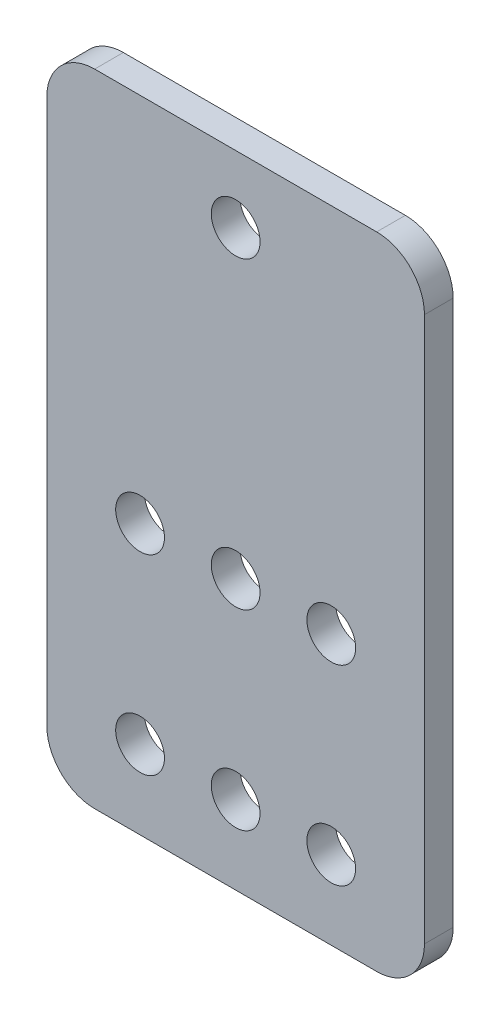
ISO-10303-21;
HEADER;
FILE_DESCRIPTION(('STEP AP214'),'2;1');
FILE_NAME('part.step','',(''),(''),'','','');
FILE_SCHEMA(('AUTOMOTIVE_DESIGN { 1 0 10303 214 1 1 1 1 }'));
ENDSEC;
DATA;
#1=APPLICATION_CONTEXT('core data for automotive mechanical design processes');
#2=APPLICATION_PROTOCOL_DEFINITION('international standard','automotive_design',2000,#1);
#3=PRODUCT_CONTEXT('',#1,'mechanical');
#4=PRODUCT('Part','Part','',(#3));
#5=PRODUCT_RELATED_PRODUCT_CATEGORY('part','',(#4));
#6=PRODUCT_DEFINITION_FORMATION('','',#4);
#7=PRODUCT_DEFINITION_CONTEXT('part definition',#1,'design');
#8=PRODUCT_DEFINITION('design','',#6,#7);
#9=PRODUCT_DEFINITION_SHAPE('','',#8);
#10=(LENGTH_UNIT() NAMED_UNIT(*) SI_UNIT(.MILLI.,.METRE.));
#11=(NAMED_UNIT(*) PLANE_ANGLE_UNIT() SI_UNIT($,.RADIAN.));
#12=(NAMED_UNIT(*) SI_UNIT($,.STERADIAN.) SOLID_ANGLE_UNIT());
#13=UNCERTAINTY_MEASURE_WITH_UNIT(LENGTH_MEASURE(1.E-05),#10,'distance_accuracy_value','');
#14=(GEOMETRIC_REPRESENTATION_CONTEXT(3) GLOBAL_UNCERTAINTY_ASSIGNED_CONTEXT((#13)) GLOBAL_UNIT_ASSIGNED_CONTEXT((#10,
#11,#12)) REPRESENTATION_CONTEXT('',''));
#15=CARTESIAN_POINT('',(0.,0.,0.));
#16=DIRECTION('',(0.,0.,1.));
#17=DIRECTION('',(1.,0.,0.));
#18=AXIS2_PLACEMENT_3D('',#15,#16,#17);
#19=CARTESIAN_POINT('',(-14.75,-28.5,3.));
#20=DIRECTION('',(0.,0.,-1.));
#21=DIRECTION('',(-1.,0.,0.));
#22=AXIS2_PLACEMENT_3D('',#19,#20,#21);
#23=PLANE('',#22);
#24=CARTESIAN_POINT('',(-14.75,-28.5,3.));
#25=DIRECTION('',(0.,0.,1.));
#26=DIRECTION('',(-1.,0.,0.));
#27=AXIS2_PLACEMENT_3D('',#24,#25,#26);
#28=CIRCLE('',#27,5.);
#29=CARTESIAN_POINT('',(-19.75,-28.5,3.));
#30=VERTEX_POINT('',#29);
#31=CARTESIAN_POINT('',(-14.75,-33.5,3.));
#32=VERTEX_POINT('',#31);
#33=EDGE_CURVE('E158',#30,#32,#28,.T.);
#34=ORIENTED_EDGE('',*,*,#33,.T.);
#35=DIRECTION('',(1.,0.,0.));
#36=VECTOR('',#35,1.);
#37=CARTESIAN_POINT('',(-14.75,-33.5,3.));
#38=LINE('',#37,#36);
#39=CARTESIAN_POINT('',(14.75,-33.5,3.));
#40=VERTEX_POINT('',#39);
#41=EDGE_CURVE('E105',#32,#40,#38,.T.);
#42=ORIENTED_EDGE('',*,*,#41,.T.);
#43=CARTESIAN_POINT('',(14.75,-28.5,3.));
#44=DIRECTION('',(0.,0.,1.));
#45=DIRECTION('',(1.,0.,0.));
#46=AXIS2_PLACEMENT_3D('',#43,#44,#45);
#47=CIRCLE('',#46,5.);
#48=CARTESIAN_POINT('',(19.75,-28.5,3.));
#49=VERTEX_POINT('',#48);
#50=EDGE_CURVE('E173',#40,#49,#47,.T.);
#51=ORIENTED_EDGE('',*,*,#50,.T.);
#52=DIRECTION('',(0.,1.,0.));
#53=VECTOR('',#52,1.);
#54=CARTESIAN_POINT('',(19.75,-28.5,3.));
#55=LINE('',#54,#53);
#56=CARTESIAN_POINT('',(19.75,28.5,3.));
#57=VERTEX_POINT('',#56);
#58=EDGE_CURVE('E186',#49,#57,#55,.T.);
#59=ORIENTED_EDGE('',*,*,#58,.T.);
#60=CARTESIAN_POINT('',(14.75,28.5,3.));
#61=DIRECTION('',(0.,0.,1.));
#62=DIRECTION('',(-1.,0.,0.));
#63=AXIS2_PLACEMENT_3D('',#60,#61,#62);
#64=CIRCLE('',#63,5.);
#65=CARTESIAN_POINT('',(14.75,33.5,3.));
#66=VERTEX_POINT('',#65);
#67=EDGE_CURVE('E124',#57,#66,#64,.T.);
#68=ORIENTED_EDGE('',*,*,#67,.T.);
#69=DIRECTION('',(-1.,0.,0.));
#70=VECTOR('',#69,1.);
#71=CARTESIAN_POINT('',(-14.75,33.5,3.));
#72=LINE('',#71,#70);
#73=CARTESIAN_POINT('',(-14.75,33.5,3.));
#74=VERTEX_POINT('',#73);
#75=EDGE_CURVE('E118',#66,#74,#72,.T.);
#76=ORIENTED_EDGE('',*,*,#75,.T.);
#77=CARTESIAN_POINT('',(-14.75,28.5,3.));
#78=DIRECTION('',(0.,0.,1.));
#79=DIRECTION('',(-1.,0.,0.));
#80=AXIS2_PLACEMENT_3D('',#77,#78,#79);
#81=CIRCLE('',#80,5.);
#82=CARTESIAN_POINT('',(-19.75,28.5,3.));
#83=VERTEX_POINT('',#82);
#84=EDGE_CURVE('E122',#74,#83,#81,.T.);
#85=ORIENTED_EDGE('',*,*,#84,.T.);
#86=DIRECTION('',(0.,-1.,0.));
#87=VECTOR('',#86,1.);
#88=CARTESIAN_POINT('',(-19.75,-28.5,3.));
#89=LINE('',#88,#87);
#90=EDGE_CURVE('E62',#83,#30,#89,.T.);
#91=ORIENTED_EDGE('',*,*,#90,.T.);
#92=EDGE_LOOP('',(#34,#42,#51,#59,#68,#76,#85,#91));
#93=FACE_BOUND('',#92,.T.);
#94=CARTESIAN_POINT('',(9.99999324787507,-5.28999999999959,3.));
#95=DIRECTION('',(0.,0.,1.));
#96=DIRECTION('',(1.,0.,0.));
#97=AXIS2_PLACEMENT_3D('',#94,#95,#96);
#98=CIRCLE('',#97,2.55);
#99=CARTESIAN_POINT('',(12.5499932478751,-5.28999999999959,3.));
#100=VERTEX_POINT('',#99);
#101=EDGE_CURVE('E146',#100,#100,#98,.T.);
#102=ORIENTED_EDGE('',*,*,#101,.F.);
#103=EDGE_LOOP('',(#102));
#104=FACE_BOUND('',#103,.T.);
#105=CARTESIAN_POINT('',(0.,-5.28999999999959,3.));
#106=DIRECTION('',(0.,0.,1.));
#107=DIRECTION('',(1.,0.,0.));
#108=AXIS2_PLACEMENT_3D('',#105,#106,#107);
#109=CIRCLE('',#108,2.54999999999988);
#110=CARTESIAN_POINT('',(2.54999999999988,-5.28999999999959,3.));
#111=VERTEX_POINT('',#110);
#112=EDGE_CURVE('E197',#111,#111,#109,.T.);
#113=ORIENTED_EDGE('',*,*,#112,.F.);
#114=EDGE_LOOP('',(#113));
#115=FACE_BOUND('',#114,.T.);
#116=CARTESIAN_POINT('',(-9.99999324787506,-5.28999999999959,3.));
#117=DIRECTION('',(0.,0.,1.));
#118=DIRECTION('',(1.,0.,0.));
#119=AXIS2_PLACEMENT_3D('',#116,#117,#118);
#120=CIRCLE('',#119,2.55);
#121=CARTESIAN_POINT('',(-7.44999324787506,-5.28999999999959,3.));
#122=VERTEX_POINT('',#121);
#123=EDGE_CURVE('E204',#122,#122,#120,.T.);
#124=ORIENTED_EDGE('',*,*,#123,.F.);
#125=EDGE_LOOP('',(#124));
#126=FACE_BOUND('',#125,.T.);
#127=CARTESIAN_POINT('',(6.7705587926267E-06,-25.2899999999987,3.));
#128=DIRECTION('',(0.,0.,1.));
#129=DIRECTION('',(1.,0.,0.));
#130=AXIS2_PLACEMENT_3D('',#127,#128,#129);
#131=CIRCLE('',#130,2.55);
#132=CARTESIAN_POINT('',(2.55000677055879,-25.2899999999987,3.));
#133=VERTEX_POINT('',#132);
#134=EDGE_CURVE('E211',#133,#133,#131,.T.);
#135=ORIENTED_EDGE('',*,*,#134,.F.);
#136=EDGE_LOOP('',(#135));
#137=FACE_BOUND('',#136,.T.);
#138=CARTESIAN_POINT('',(-9.99998647731627,-25.2899999999988,3.));
#139=DIRECTION('',(0.,0.,1.));
#140=DIRECTION('',(1.,0.,0.));
#141=AXIS2_PLACEMENT_3D('',#138,#139,#140);
#142=CIRCLE('',#141,2.55);
#143=CARTESIAN_POINT('',(-7.44998647731627,-25.2899999999988,3.));
#144=VERTEX_POINT('',#143);
#145=EDGE_CURVE('E218',#144,#144,#142,.T.);
#146=ORIENTED_EDGE('',*,*,#145,.F.);
#147=EDGE_LOOP('',(#146));
#148=FACE_BOUND('',#147,.T.);
#149=CARTESIAN_POINT('',(10.0000000184339,-25.2899999999986,3.));
#150=DIRECTION('',(0.,0.,1.));
#151=DIRECTION('',(1.,0.,0.));
#152=AXIS2_PLACEMENT_3D('',#149,#150,#151);
#153=CIRCLE('',#152,2.55);
#154=CARTESIAN_POINT('',(12.5500000184339,-25.2899999999986,3.));
#155=VERTEX_POINT('',#154);
#156=EDGE_CURVE('E224',#155,#155,#153,.T.);
#157=ORIENTED_EDGE('',*,*,#156,.F.);
#158=EDGE_LOOP('',(#157));
#159=FACE_BOUND('',#158,.T.);
#160=CARTESIAN_POINT('',(0.,26.5000000000011,3.));
#161=DIRECTION('',(0.,0.,1.));
#162=DIRECTION('',(1.,0.,0.));
#163=AXIS2_PLACEMENT_3D('',#160,#161,#162);
#164=CIRCLE('',#163,2.54999999999968);
#165=CARTESIAN_POINT('',(2.54999999999968,26.5000000000011,3.));
#166=VERTEX_POINT('',#165);
#167=EDGE_CURVE('E230',#166,#166,#164,.T.);
#168=ORIENTED_EDGE('',*,*,#167,.F.);
#169=EDGE_LOOP('',(#168));
#170=FACE_BOUND('',#169,.T.);
#171=ADVANCED_FACE('F45',(#93,#104,#115,#126,#137,#148,#159,#170),#23,.F.);
#172=CARTESIAN_POINT('',(-14.75,-28.5,0.));
#173=DIRECTION('',(0.,0.,-1.));
#174=DIRECTION('',(-1.,0.,0.));
#175=AXIS2_PLACEMENT_3D('',#172,#173,#174);
#176=PLANE('',#175);
#177=CARTESIAN_POINT('',(10.0000000184339,-25.2899999999986,0.));
#178=DIRECTION('',(0.,0.,1.));
#179=DIRECTION('',(1.,0.,0.));
#180=AXIS2_PLACEMENT_3D('',#177,#178,#179);
#181=CIRCLE('',#180,2.55);
#182=CARTESIAN_POINT('',(12.5500000184339,-25.2899999999986,0.));
#183=VERTEX_POINT('',#182);
#184=EDGE_CURVE('E227',#183,#183,#181,.T.);
#185=ORIENTED_EDGE('',*,*,#184,.T.);
#186=EDGE_LOOP('',(#185));
#187=FACE_BOUND('',#186,.T.);
#188=CARTESIAN_POINT('',(6.7705587926267E-06,-25.2899999999987,0.));
#189=DIRECTION('',(0.,0.,1.));
#190=DIRECTION('',(1.,0.,0.));
#191=AXIS2_PLACEMENT_3D('',#188,#189,#190);
#192=CIRCLE('',#191,2.55);
#193=CARTESIAN_POINT('',(2.55000677055879,-25.2899999999987,0.));
#194=VERTEX_POINT('',#193);
#195=EDGE_CURVE('E215',#194,#194,#192,.T.);
#196=ORIENTED_EDGE('',*,*,#195,.T.);
#197=EDGE_LOOP('',(#196));
#198=FACE_BOUND('',#197,.T.);
#199=CARTESIAN_POINT('',(0.,-5.28999999999959,0.));
#200=DIRECTION('',(0.,0.,1.));
#201=DIRECTION('',(1.,0.,0.));
#202=AXIS2_PLACEMENT_3D('',#199,#200,#201);
#203=CIRCLE('',#202,2.54999999999988);
#204=CARTESIAN_POINT('',(2.54999999999988,-5.28999999999959,0.));
#205=VERTEX_POINT('',#204);
#206=EDGE_CURVE('E201',#205,#205,#203,.T.);
#207=ORIENTED_EDGE('',*,*,#206,.T.);
#208=EDGE_LOOP('',(#207));
#209=FACE_BOUND('',#208,.T.);
#210=CARTESIAN_POINT('',(-14.75,-28.5,0.));
#211=DIRECTION('',(0.,0.,1.));
#212=DIRECTION('',(-1.,0.,0.));
#213=AXIS2_PLACEMENT_3D('',#210,#211,#212);
#214=CIRCLE('',#213,5.);
#215=CARTESIAN_POINT('',(-19.75,-28.5,0.));
#216=VERTEX_POINT('',#215);
#217=CARTESIAN_POINT('',(-14.75,-33.5,0.));
#218=VERTEX_POINT('',#217);
#219=EDGE_CURVE('E142',#216,#218,#214,.T.);
#220=ORIENTED_EDGE('',*,*,#219,.F.);
#221=DIRECTION('',(0.,-1.,0.));
#222=VECTOR('',#221,1.);
#223=CARTESIAN_POINT('',(-19.75,-28.5,0.));
#224=LINE('',#223,#222);
#225=CARTESIAN_POINT('',(-19.75,28.5,0.));
#226=VERTEX_POINT('',#225);
#227=EDGE_CURVE('E97',#226,#216,#224,.T.);
#228=ORIENTED_EDGE('',*,*,#227,.F.);
#229=CARTESIAN_POINT('',(-14.75,28.5,0.));
#230=DIRECTION('',(0.,0.,1.));
#231=DIRECTION('',(-1.,0.,0.));
#232=AXIS2_PLACEMENT_3D('',#229,#230,#231);
#233=CIRCLE('',#232,5.);
#234=CARTESIAN_POINT('',(-14.75,33.5,0.));
#235=VERTEX_POINT('',#234);
#236=EDGE_CURVE('E91',#235,#226,#233,.T.);
#237=ORIENTED_EDGE('',*,*,#236,.F.);
#238=DIRECTION('',(-1.,0.,0.));
#239=VECTOR('',#238,1.);
#240=CARTESIAN_POINT('',(-14.75,33.5,0.));
#241=LINE('',#240,#239);
#242=CARTESIAN_POINT('',(14.75,33.5,0.));
#243=VERTEX_POINT('',#242);
#244=EDGE_CURVE('E132',#243,#235,#241,.T.);
#245=ORIENTED_EDGE('',*,*,#244,.F.);
#246=CARTESIAN_POINT('',(14.75,28.5,0.));
#247=DIRECTION('',(0.,0.,1.));
#248=DIRECTION('',(-1.,0.,0.));
#249=AXIS2_PLACEMENT_3D('',#246,#247,#248);
#250=CIRCLE('',#249,5.);
#251=CARTESIAN_POINT('',(19.75,28.5,0.));
#252=VERTEX_POINT('',#251);
#253=EDGE_CURVE('E153',#252,#243,#250,.T.);
#254=ORIENTED_EDGE('',*,*,#253,.F.);
#255=DIRECTION('',(0.,1.,0.));
#256=VECTOR('',#255,1.);
#257=CARTESIAN_POINT('',(19.75,-28.5,0.));
#258=LINE('',#257,#256);
#259=CARTESIAN_POINT('',(19.75,-28.5,0.));
#260=VERTEX_POINT('',#259);
#261=EDGE_CURVE('E151',#260,#252,#258,.T.);
#262=ORIENTED_EDGE('',*,*,#261,.F.);
#263=CARTESIAN_POINT('',(14.75,-28.5,0.));
#264=DIRECTION('',(0.,0.,1.));
#265=DIRECTION('',(1.,0.,0.));
#266=AXIS2_PLACEMENT_3D('',#263,#264,#265);
#267=CIRCLE('',#266,5.);
#268=CARTESIAN_POINT('',(14.75,-33.5,0.));
#269=VERTEX_POINT('',#268);
#270=EDGE_CURVE('E149',#269,#260,#267,.T.);
#271=ORIENTED_EDGE('',*,*,#270,.F.);
#272=DIRECTION('',(1.,0.,0.));
#273=VECTOR('',#272,1.);
#274=CARTESIAN_POINT('',(-14.75,-33.5,0.));
#275=LINE('',#274,#273);
#276=EDGE_CURVE('E145',#218,#269,#275,.T.);
#277=ORIENTED_EDGE('',*,*,#276,.F.);
#278=EDGE_LOOP('',(#220,#228,#237,#245,#254,#262,#271,#277));
#279=FACE_BOUND('',#278,.T.);
#280=CARTESIAN_POINT('',(9.99999324787507,-5.28999999999959,0.));
#281=DIRECTION('',(0.,0.,1.));
#282=DIRECTION('',(1.,0.,0.));
#283=AXIS2_PLACEMENT_3D('',#280,#281,#282);
#284=CIRCLE('',#283,2.55);
#285=CARTESIAN_POINT('',(12.5499932478751,-5.28999999999959,0.));
#286=VERTEX_POINT('',#285);
#287=EDGE_CURVE('E193',#286,#286,#284,.T.);
#288=ORIENTED_EDGE('',*,*,#287,.T.);
#289=EDGE_LOOP('',(#288));
#290=FACE_BOUND('',#289,.T.);
#291=CARTESIAN_POINT('',(-9.99999324787506,-5.28999999999959,0.));
#292=DIRECTION('',(0.,0.,1.));
#293=DIRECTION('',(1.,0.,0.));
#294=AXIS2_PLACEMENT_3D('',#291,#292,#293);
#295=CIRCLE('',#294,2.55);
#296=CARTESIAN_POINT('',(-7.44999324787506,-5.28999999999959,0.));
#297=VERTEX_POINT('',#296);
#298=EDGE_CURVE('E208',#297,#297,#295,.T.);
#299=ORIENTED_EDGE('',*,*,#298,.T.);
#300=EDGE_LOOP('',(#299));
#301=FACE_BOUND('',#300,.T.);
#302=CARTESIAN_POINT('',(-9.99998647731627,-25.2899999999988,0.));
#303=DIRECTION('',(0.,0.,1.));
#304=DIRECTION('',(1.,0.,0.));
#305=AXIS2_PLACEMENT_3D('',#302,#303,#304);
#306=CIRCLE('',#305,2.55);
#307=CARTESIAN_POINT('',(-7.44998647731627,-25.2899999999988,0.));
#308=VERTEX_POINT('',#307);
#309=EDGE_CURVE('E221',#308,#308,#306,.T.);
#310=ORIENTED_EDGE('',*,*,#309,.T.);
#311=EDGE_LOOP('',(#310));
#312=FACE_BOUND('',#311,.T.);
#313=CARTESIAN_POINT('',(0.,26.5000000000011,0.));
#314=DIRECTION('',(0.,0.,1.));
#315=DIRECTION('',(1.,0.,0.));
#316=AXIS2_PLACEMENT_3D('',#313,#314,#315);
#317=CIRCLE('',#316,2.54999999999968);
#318=CARTESIAN_POINT('',(2.54999999999968,26.5000000000011,0.));
#319=VERTEX_POINT('',#318);
#320=EDGE_CURVE('E233',#319,#319,#317,.T.);
#321=ORIENTED_EDGE('',*,*,#320,.T.);
#322=EDGE_LOOP('',(#321));
#323=FACE_BOUND('',#322,.T.);
#324=ADVANCED_FACE('F177',(#187,#198,#209,#279,#290,#301,#312,#323),#176,.T.);
#325=CARTESIAN_POINT('',(-14.75,-28.5,3.));
#326=DIRECTION('',(0.,0.,-1.));
#327=DIRECTION('',(-1.,0.,0.));
#328=AXIS2_PLACEMENT_3D('',#325,#326,#327);
#329=CYLINDRICAL_SURFACE('',#328,5.);
#330=ORIENTED_EDGE('',*,*,#219,.T.);
#331=DIRECTION('',(0.,0.,-1.));
#332=VECTOR('',#331,1.);
#333=CARTESIAN_POINT('',(-14.75,-33.5,3.));
#334=LINE('',#333,#332);
#335=EDGE_CURVE('E11',#32,#218,#334,.T.);
#336=ORIENTED_EDGE('',*,*,#335,.F.);
#337=ORIENTED_EDGE('',*,*,#33,.F.);
#338=DIRECTION('',(0.,0.,-1.));
#339=VECTOR('',#338,1.);
#340=CARTESIAN_POINT('',(-19.75,-28.5,3.));
#341=LINE('',#340,#339);
#342=EDGE_CURVE('E138',#30,#216,#341,.T.);
#343=ORIENTED_EDGE('',*,*,#342,.T.);
#344=EDGE_LOOP('',(#330,#336,#337,#343));
#345=FACE_BOUND('',#344,.T.);
#346=ADVANCED_FACE('F47',(#345),#329,.T.);
#347=CARTESIAN_POINT('',(-14.75,-33.5,3.));
#348=DIRECTION('',(0.,1.,0.));
#349=DIRECTION('',(0.,0.,1.));
#350=AXIS2_PLACEMENT_3D('',#347,#348,#349);
#351=PLANE('',#350);
#352=ORIENTED_EDGE('',*,*,#276,.T.);
#353=DIRECTION('',(0.,0.,-1.));
#354=VECTOR('',#353,1.);
#355=CARTESIAN_POINT('',(14.75,-33.5,3.));
#356=LINE('',#355,#354);
#357=EDGE_CURVE('E54',#40,#269,#356,.T.);
#358=ORIENTED_EDGE('',*,*,#357,.F.);
#359=ORIENTED_EDGE('',*,*,#41,.F.);
#360=ORIENTED_EDGE('',*,*,#335,.T.);
#361=EDGE_LOOP('',(#352,#358,#359,#360));
#362=FACE_BOUND('',#361,.T.);
#363=ADVANCED_FACE('F268',(#362),#351,.F.);
#364=CARTESIAN_POINT('',(14.75,-28.5,3.));
#365=DIRECTION('',(0.,0.,-1.));
#366=DIRECTION('',(-1.,0.,0.));
#367=AXIS2_PLACEMENT_3D('',#364,#365,#366);
#368=CYLINDRICAL_SURFACE('',#367,5.);
#369=ORIENTED_EDGE('',*,*,#270,.T.);
#370=DIRECTION('',(0.,0.,-1.));
#371=VECTOR('',#370,1.);
#372=CARTESIAN_POINT('',(19.75,-28.5,3.));
#373=LINE('',#372,#371);
#374=EDGE_CURVE('E165',#49,#260,#373,.T.);
#375=ORIENTED_EDGE('',*,*,#374,.F.);
#376=ORIENTED_EDGE('',*,*,#50,.F.);
#377=ORIENTED_EDGE('',*,*,#357,.T.);
#378=EDGE_LOOP('',(#369,#375,#376,#377));
#379=FACE_BOUND('',#378,.T.);
#380=ADVANCED_FACE('F171',(#379),#368,.T.);
#381=CARTESIAN_POINT('',(19.75,-28.5,3.));
#382=DIRECTION('',(-1.,0.,0.));
#383=DIRECTION('',(0.,0.,1.));
#384=AXIS2_PLACEMENT_3D('',#381,#382,#383);
#385=PLANE('',#384);
#386=ORIENTED_EDGE('',*,*,#261,.T.);
#387=DIRECTION('',(0.,0.,-1.));
#388=VECTOR('',#387,1.);
#389=CARTESIAN_POINT('',(19.75,28.5,3.));
#390=LINE('',#389,#388);
#391=EDGE_CURVE('E162',#57,#252,#390,.T.);
#392=ORIENTED_EDGE('',*,*,#391,.F.);
#393=ORIENTED_EDGE('',*,*,#58,.F.);
#394=ORIENTED_EDGE('',*,*,#374,.T.);
#395=EDGE_LOOP('',(#386,#392,#393,#394));
#396=FACE_BOUND('',#395,.T.);
#397=ADVANCED_FACE('F182',(#396),#385,.F.);
#398=CARTESIAN_POINT('',(14.75,28.5,3.));
#399=DIRECTION('',(0.,0.,-1.));
#400=DIRECTION('',(-1.,0.,0.));
#401=AXIS2_PLACEMENT_3D('',#398,#399,#400);
#402=CYLINDRICAL_SURFACE('',#401,5.);
#403=ORIENTED_EDGE('',*,*,#253,.T.);
#404=DIRECTION('',(0.,0.,-1.));
#405=VECTOR('',#404,1.);
#406=CARTESIAN_POINT('',(14.75,33.5,3.));
#407=LINE('',#406,#405);
#408=EDGE_CURVE('E133',#66,#243,#407,.T.);
#409=ORIENTED_EDGE('',*,*,#408,.F.);
#410=ORIENTED_EDGE('',*,*,#67,.F.);
#411=ORIENTED_EDGE('',*,*,#391,.T.);
#412=EDGE_LOOP('',(#403,#409,#410,#411));
#413=FACE_BOUND('',#412,.T.);
#414=ADVANCED_FACE('F185',(#413),#402,.T.);
#415=CARTESIAN_POINT('',(-14.75,33.5,3.));
#416=DIRECTION('',(0.,-1.,0.));
#417=DIRECTION('',(1.,0.,0.));
#418=AXIS2_PLACEMENT_3D('',#415,#416,#417);
#419=PLANE('',#418);
#420=ORIENTED_EDGE('',*,*,#244,.T.);
#421=DIRECTION('',(0.,0.,-1.));
#422=VECTOR('',#421,1.);
#423=CARTESIAN_POINT('',(-14.75,33.5,3.));
#424=LINE('',#423,#422);
#425=EDGE_CURVE('E129',#74,#235,#424,.T.);
#426=ORIENTED_EDGE('',*,*,#425,.F.);
#427=ORIENTED_EDGE('',*,*,#75,.F.);
#428=ORIENTED_EDGE('',*,*,#408,.T.);
#429=EDGE_LOOP('',(#420,#426,#427,#428));
#430=FACE_BOUND('',#429,.T.);
#431=ADVANCED_FACE('F130',(#430),#419,.F.);
#432=CARTESIAN_POINT('',(-14.75,28.5,3.));
#433=DIRECTION('',(0.,0.,-1.));
#434=DIRECTION('',(-1.,0.,0.));
#435=AXIS2_PLACEMENT_3D('',#432,#433,#434);
#436=CYLINDRICAL_SURFACE('',#435,5.);
#437=ORIENTED_EDGE('',*,*,#236,.T.);
#438=DIRECTION('',(0.,0.,-1.));
#439=VECTOR('',#438,1.);
#440=CARTESIAN_POINT('',(-19.75,28.5,3.));
#441=LINE('',#440,#439);
#442=EDGE_CURVE('E134',#83,#226,#441,.T.);
#443=ORIENTED_EDGE('',*,*,#442,.F.);
#444=ORIENTED_EDGE('',*,*,#84,.F.);
#445=ORIENTED_EDGE('',*,*,#425,.T.);
#446=EDGE_LOOP('',(#437,#443,#444,#445));
#447=FACE_BOUND('',#446,.T.);
#448=ADVANCED_FACE('F136',(#447),#436,.T.);
#449=CARTESIAN_POINT('',(-19.75,-28.5,3.));
#450=DIRECTION('',(1.,0.,0.));
#451=DIRECTION('',(0.,0.,-1.));
#452=AXIS2_PLACEMENT_3D('',#449,#450,#451);
#453=PLANE('',#452);
#454=ORIENTED_EDGE('',*,*,#227,.T.);
#455=ORIENTED_EDGE('',*,*,#342,.F.);
#456=ORIENTED_EDGE('',*,*,#90,.F.);
#457=ORIENTED_EDGE('',*,*,#442,.T.);
#458=EDGE_LOOP('',(#454,#455,#456,#457));
#459=FACE_BOUND('',#458,.T.);
#460=ADVANCED_FACE('F256',(#459),#453,.F.);
#461=CARTESIAN_POINT('',(9.99999324787507,-5.28999999999959,3.));
#462=DIRECTION('',(0.,0.,-1.));
#463=DIRECTION('',(-1.,0.,0.));
#464=AXIS2_PLACEMENT_3D('',#461,#462,#463);
#465=CYLINDRICAL_SURFACE('',#464,2.55);
#466=ORIENTED_EDGE('',*,*,#101,.T.);
#467=EDGE_LOOP('',(#466));
#468=FACE_BOUND('',#467,.T.);
#469=ORIENTED_EDGE('',*,*,#287,.F.);
#470=EDGE_LOOP('',(#469));
#471=FACE_BOUND('',#470,.T.);
#472=ADVANCED_FACE('F253',(#468,#471),#465,.F.);
#473=CARTESIAN_POINT('',(0.,-5.28999999999959,3.));
#474=DIRECTION('',(0.,0.,-1.));
#475=DIRECTION('',(-1.,0.,0.));
#476=AXIS2_PLACEMENT_3D('',#473,#474,#475);
#477=CYLINDRICAL_SURFACE('',#476,2.54999999999988);
#478=ORIENTED_EDGE('',*,*,#112,.T.);
#479=EDGE_LOOP('',(#478));
#480=FACE_BOUND('',#479,.T.);
#481=ORIENTED_EDGE('',*,*,#206,.F.);
#482=EDGE_LOOP('',(#481));
#483=FACE_BOUND('',#482,.T.);
#484=ADVANCED_FACE('F336',(#480,#483),#477,.F.);
#485=CARTESIAN_POINT('',(-9.99999324787506,-5.28999999999959,3.));
#486=DIRECTION('',(0.,0.,-1.));
#487=DIRECTION('',(-1.,0.,0.));
#488=AXIS2_PLACEMENT_3D('',#485,#486,#487);
#489=CYLINDRICAL_SURFACE('',#488,2.55);
#490=ORIENTED_EDGE('',*,*,#123,.T.);
#491=EDGE_LOOP('',(#490));
#492=FACE_BOUND('',#491,.T.);
#493=ORIENTED_EDGE('',*,*,#298,.F.);
#494=EDGE_LOOP('',(#493));
#495=FACE_BOUND('',#494,.T.);
#496=ADVANCED_FACE('F344',(#492,#495),#489,.F.);
#497=CARTESIAN_POINT('',(6.7705587926267E-06,-25.2899999999987,3.));
#498=DIRECTION('',(0.,0.,-1.));
#499=DIRECTION('',(-1.,0.,0.));
#500=AXIS2_PLACEMENT_3D('',#497,#498,#499);
#501=CYLINDRICAL_SURFACE('',#500,2.55);
#502=ORIENTED_EDGE('',*,*,#134,.T.);
#503=EDGE_LOOP('',(#502));
#504=FACE_BOUND('',#503,.T.);
#505=ORIENTED_EDGE('',*,*,#195,.F.);
#506=EDGE_LOOP('',(#505));
#507=FACE_BOUND('',#506,.T.);
#508=ADVANCED_FACE('F352',(#504,#507),#501,.F.);
#509=CARTESIAN_POINT('',(-9.99998647731627,-25.2899999999988,3.));
#510=DIRECTION('',(0.,0.,-1.));
#511=DIRECTION('',(-1.,0.,0.));
#512=AXIS2_PLACEMENT_3D('',#509,#510,#511);
#513=CYLINDRICAL_SURFACE('',#512,2.55);
#514=ORIENTED_EDGE('',*,*,#145,.T.);
#515=EDGE_LOOP('',(#514));
#516=FACE_BOUND('',#515,.T.);
#517=ORIENTED_EDGE('',*,*,#309,.F.);
#518=EDGE_LOOP('',(#517));
#519=FACE_BOUND('',#518,.T.);
#520=ADVANCED_FACE('F361',(#516,#519),#513,.F.);
#521=CARTESIAN_POINT('',(10.0000000184339,-25.2899999999986,3.));
#522=DIRECTION('',(0.,0.,-1.));
#523=DIRECTION('',(-1.,0.,0.));
#524=AXIS2_PLACEMENT_3D('',#521,#522,#523);
#525=CYLINDRICAL_SURFACE('',#524,2.55);
#526=ORIENTED_EDGE('',*,*,#156,.T.);
#527=EDGE_LOOP('',(#526));
#528=FACE_BOUND('',#527,.T.);
#529=ORIENTED_EDGE('',*,*,#184,.F.);
#530=EDGE_LOOP('',(#529));
#531=FACE_BOUND('',#530,.T.);
#532=ADVANCED_FACE('F370',(#528,#531),#525,.F.);
#533=CARTESIAN_POINT('',(0.,26.5000000000011,3.));
#534=DIRECTION('',(0.,0.,-1.));
#535=DIRECTION('',(-1.,0.,0.));
#536=AXIS2_PLACEMENT_3D('',#533,#534,#535);
#537=CYLINDRICAL_SURFACE('',#536,2.54999999999968);
#538=ORIENTED_EDGE('',*,*,#167,.T.);
#539=EDGE_LOOP('',(#538));
#540=FACE_BOUND('',#539,.T.);
#541=ORIENTED_EDGE('',*,*,#320,.F.);
#542=EDGE_LOOP('',(#541));
#543=FACE_BOUND('',#542,.T.);
#544=ADVANCED_FACE('F243',(#540,#543),#537,.F.);
#545=CLOSED_SHELL('',(#171,#324,#346,#363,#380,#397,#414,#431,#448,#460,#472,#484,#496,#508,
#520,#532,#544));
#546=MANIFOLD_SOLID_BREP('B2',#545);
#547=ADVANCED_BREP_SHAPE_REPRESENTATION('',(#18,#546),#14);
#548=SHAPE_DEFINITION_REPRESENTATION(#9,#547);
ENDSEC;
END-ISO-10303-21;
